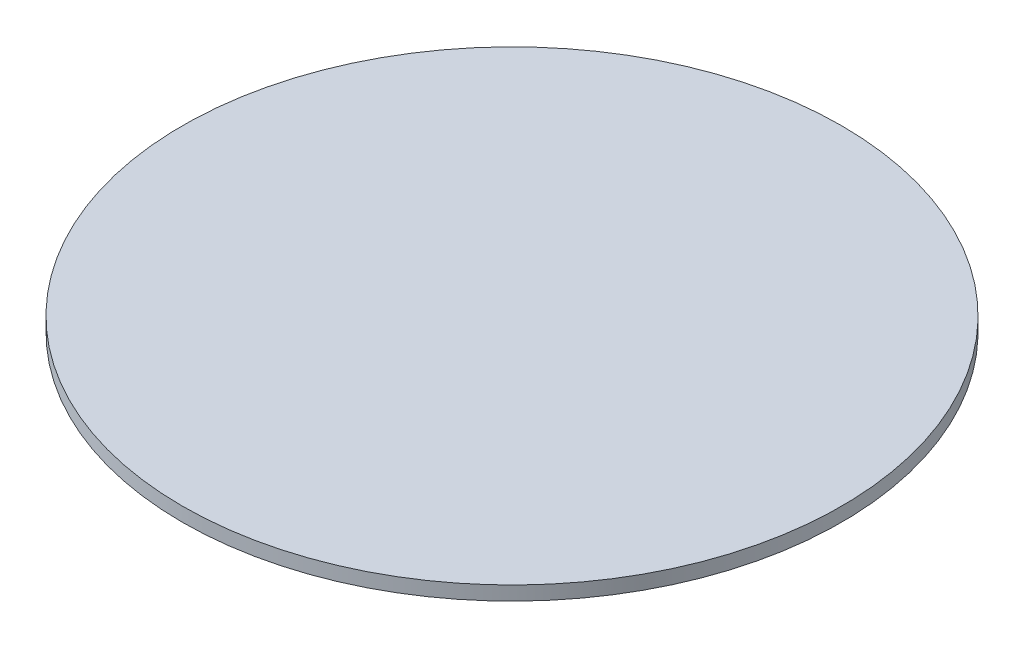
ISO-10303-21;
HEADER;
FILE_DESCRIPTION(('STEP AP214'),'2;1');
FILE_NAME('part.step','',(''),(''),'','','');
FILE_SCHEMA(('AUTOMOTIVE_DESIGN { 1 0 10303 214 1 1 1 1 }'));
ENDSEC;
DATA;
#1=APPLICATION_CONTEXT('core data for automotive mechanical design processes');
#2=APPLICATION_PROTOCOL_DEFINITION('international standard','automotive_design',2000,#1);
#3=PRODUCT_CONTEXT('',#1,'mechanical');
#4=PRODUCT('Part','Part','',(#3));
#5=PRODUCT_RELATED_PRODUCT_CATEGORY('part','',(#4));
#6=PRODUCT_DEFINITION_FORMATION('','',#4);
#7=PRODUCT_DEFINITION_CONTEXT('part definition',#1,'design');
#8=PRODUCT_DEFINITION('design','',#6,#7);
#9=PRODUCT_DEFINITION_SHAPE('','',#8);
#10=(LENGTH_UNIT() NAMED_UNIT(*) SI_UNIT(.MILLI.,.METRE.));
#11=(NAMED_UNIT(*) PLANE_ANGLE_UNIT() SI_UNIT($,.RADIAN.));
#12=(NAMED_UNIT(*) SI_UNIT($,.STERADIAN.) SOLID_ANGLE_UNIT());
#13=UNCERTAINTY_MEASURE_WITH_UNIT(LENGTH_MEASURE(1.E-05),#10,'distance_accuracy_value','');
#14=(GEOMETRIC_REPRESENTATION_CONTEXT(3) GLOBAL_UNCERTAINTY_ASSIGNED_CONTEXT((#13)) GLOBAL_UNIT_ASSIGNED_CONTEXT((#10,
#11,#12)) REPRESENTATION_CONTEXT('',''));
#15=CARTESIAN_POINT('',(0.,0.,0.));
#16=DIRECTION('',(0.,0.,1.));
#17=DIRECTION('',(1.,0.,0.));
#18=AXIS2_PLACEMENT_3D('',#15,#16,#17);
#19=CARTESIAN_POINT('',(0.,-2.,0.));
#20=DIRECTION('',(0.,1.,0.));
#21=DIRECTION('',(0.,0.,1.));
#22=AXIS2_PLACEMENT_3D('',#19,#20,#21);
#23=CYLINDRICAL_SURFACE('',#22,47.0877936481514);
#24=CARTESIAN_POINT('',(0.,-2.,0.));
#25=DIRECTION('',(0.,1.,0.));
#26=DIRECTION('',(0.,0.,1.));
#27=AXIS2_PLACEMENT_3D('',#24,#25,#26);
#28=CIRCLE('',#27,47.0877936481514);
#29=CARTESIAN_POINT('',(0.,-2.,47.0877936481514));
#30=VERTEX_POINT('',#29);
#31=EDGE_CURVE('E10',#30,#30,#28,.T.);
#32=ORIENTED_EDGE('',*,*,#31,.T.);
#33=EDGE_LOOP('',(#32));
#34=FACE_BOUND('',#33,.T.);
#35=CARTESIAN_POINT('',(0.,0.,0.));
#36=DIRECTION('',(0.,1.,0.));
#37=DIRECTION('',(0.,0.,1.));
#38=AXIS2_PLACEMENT_3D('',#35,#36,#37);
#39=CIRCLE('',#38,47.0877936481514);
#40=CARTESIAN_POINT('',(0.,0.,47.0877936481514));
#41=VERTEX_POINT('',#40);
#42=EDGE_CURVE('E38',#41,#41,#39,.T.);
#43=ORIENTED_EDGE('',*,*,#42,.F.);
#44=EDGE_LOOP('',(#43));
#45=FACE_BOUND('',#44,.T.);
#46=ADVANCED_FACE('F35',(#34,#45),#23,.T.);
#47=CARTESIAN_POINT('',(0.,-2.,0.));
#48=DIRECTION('',(0.,1.,0.));
#49=DIRECTION('',(0.,0.,1.));
#50=AXIS2_PLACEMENT_3D('',#47,#48,#49);
#51=PLANE('',#50);
#52=ORIENTED_EDGE('',*,*,#31,.F.);
#53=EDGE_LOOP('',(#52));
#54=FACE_BOUND('',#53,.T.);
#55=ADVANCED_FACE('F50',(#54),#51,.F.);
#56=CARTESIAN_POINT('',(0.,0.,0.));
#57=DIRECTION('',(0.,1.,0.));
#58=DIRECTION('',(0.,0.,1.));
#59=AXIS2_PLACEMENT_3D('',#56,#57,#58);
#60=PLANE('',#59);
#61=ORIENTED_EDGE('',*,*,#42,.T.);
#62=EDGE_LOOP('',(#61));
#63=FACE_BOUND('',#62,.T.);
#64=ADVANCED_FACE('F47',(#63),#60,.T.);
#65=CLOSED_SHELL('',(#46,#55,#64));
#66=MANIFOLD_SOLID_BREP('B2',#65);
#67=ADVANCED_BREP_SHAPE_REPRESENTATION('',(#18,#66),#14);
#68=SHAPE_DEFINITION_REPRESENTATION(#9,#67);
ENDSEC;
END-ISO-10303-21;
